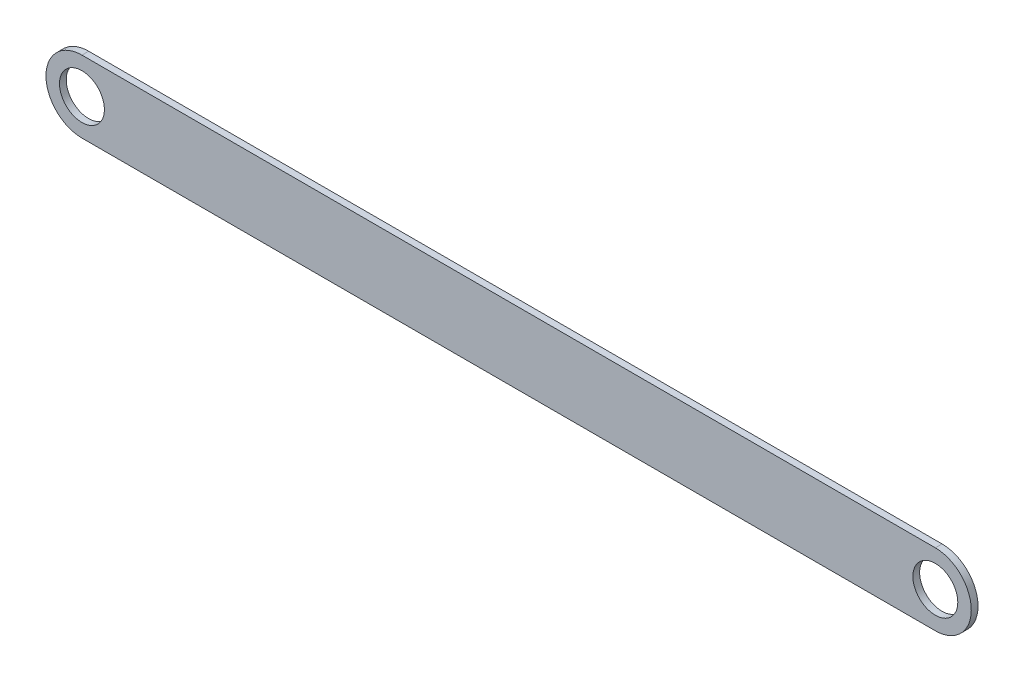
ISO-10303-21;
HEADER;
FILE_DESCRIPTION(('STEP AP214'),'2;1');
FILE_NAME('part.step','',(''),(''),'','','');
FILE_SCHEMA(('AUTOMOTIVE_DESIGN { 1 0 10303 214 1 1 1 1 }'));
ENDSEC;
DATA;
#1=APPLICATION_CONTEXT('core data for automotive mechanical design processes');
#2=APPLICATION_PROTOCOL_DEFINITION('international standard','automotive_design',2000,#1);
#3=PRODUCT_CONTEXT('',#1,'mechanical');
#4=PRODUCT('Part','Part','',(#3));
#5=PRODUCT_RELATED_PRODUCT_CATEGORY('part','',(#4));
#6=PRODUCT_DEFINITION_FORMATION('','',#4);
#7=PRODUCT_DEFINITION_CONTEXT('part definition',#1,'design');
#8=PRODUCT_DEFINITION('design','',#6,#7);
#9=PRODUCT_DEFINITION_SHAPE('','',#8);
#10=(LENGTH_UNIT() NAMED_UNIT(*) SI_UNIT(.MILLI.,.METRE.));
#11=(NAMED_UNIT(*) PLANE_ANGLE_UNIT() SI_UNIT($,.RADIAN.));
#12=(NAMED_UNIT(*) SI_UNIT($,.STERADIAN.) SOLID_ANGLE_UNIT());
#13=UNCERTAINTY_MEASURE_WITH_UNIT(LENGTH_MEASURE(1.E-05),#10,'distance_accuracy_value','');
#14=(GEOMETRIC_REPRESENTATION_CONTEXT(3) GLOBAL_UNCERTAINTY_ASSIGNED_CONTEXT((#13)) GLOBAL_UNIT_ASSIGNED_CONTEXT((#10,
#11,#12)) REPRESENTATION_CONTEXT('',''));
#15=CARTESIAN_POINT('',(0.,0.,0.));
#16=DIRECTION('',(0.,0.,1.));
#17=DIRECTION('',(1.,0.,0.));
#18=AXIS2_PLACEMENT_3D('',#15,#16,#17);
#19=CARTESIAN_POINT('',(-95.,0.,1.5));
#20=DIRECTION('',(0.,0.,1.));
#21=DIRECTION('',(1.,0.,0.));
#22=AXIS2_PLACEMENT_3D('',#19,#20,#21);
#23=PLANE('',#22);
#24=CARTESIAN_POINT('',(-95.,0.,1.5));
#25=DIRECTION('',(0.,0.,1.));
#26=DIRECTION('',(1.,0.,0.));
#27=AXIS2_PLACEMENT_3D('',#24,#25,#26);
#28=CIRCLE('',#27,5.);
#29=CARTESIAN_POINT('',(-90.,0.,1.5));
#30=VERTEX_POINT('',#29);
#31=EDGE_CURVE('E104',#30,#30,#28,.T.);
#32=ORIENTED_EDGE('',*,*,#31,.F.);
#33=EDGE_LOOP('',(#32));
#34=FACE_BOUND('',#33,.T.);
#35=CARTESIAN_POINT('',(-95.,0.,1.5));
#36=DIRECTION('',(0.,0.,1.));
#37=DIRECTION('',(1.,0.,0.));
#38=AXIS2_PLACEMENT_3D('',#35,#36,#37);
#39=CIRCLE('',#38,8.);
#40=CARTESIAN_POINT('',(-95.,8.,1.5));
#41=VERTEX_POINT('',#40);
#42=CARTESIAN_POINT('',(-95.,-8.,1.5));
#43=VERTEX_POINT('',#42);
#44=EDGE_CURVE('E89',#41,#43,#39,.T.);
#45=ORIENTED_EDGE('',*,*,#44,.T.);
#46=DIRECTION('',(1.,0.,0.));
#47=VECTOR('',#46,1.);
#48=CARTESIAN_POINT('',(-95.,-8.,1.5));
#49=LINE('',#48,#47);
#50=CARTESIAN_POINT('',(95.,-7.99999999999997,1.5));
#51=VERTEX_POINT('',#50);
#52=EDGE_CURVE('E84',#43,#51,#49,.T.);
#53=ORIENTED_EDGE('',*,*,#52,.T.);
#54=CARTESIAN_POINT('',(95.,0.,1.5));
#55=DIRECTION('',(0.,0.,1.));
#56=DIRECTION('',(1.,0.,0.));
#57=AXIS2_PLACEMENT_3D('',#54,#55,#56);
#58=CIRCLE('',#57,8.);
#59=CARTESIAN_POINT('',(95.,8.00000000000004,1.5));
#60=VERTEX_POINT('',#59);
#61=EDGE_CURVE('E87',#51,#60,#58,.T.);
#62=ORIENTED_EDGE('',*,*,#61,.T.);
#63=DIRECTION('',(-1.,0.,0.));
#64=VECTOR('',#63,1.);
#65=CARTESIAN_POINT('',(-95.,8.,1.5));
#66=LINE('',#65,#64);
#67=EDGE_CURVE('E54',#60,#41,#66,.T.);
#68=ORIENTED_EDGE('',*,*,#67,.T.);
#69=EDGE_LOOP('',(#45,#53,#62,#68));
#70=FACE_BOUND('',#69,.T.);
#71=CARTESIAN_POINT('',(95.,0.,1.5));
#72=DIRECTION('',(0.,0.,1.));
#73=DIRECTION('',(1.,0.,0.));
#74=AXIS2_PLACEMENT_3D('',#71,#72,#73);
#75=CIRCLE('',#74,5.);
#76=CARTESIAN_POINT('',(100.,0.,1.5));
#77=VERTEX_POINT('',#76);
#78=EDGE_CURVE('E119',#77,#77,#75,.T.);
#79=ORIENTED_EDGE('',*,*,#78,.F.);
#80=EDGE_LOOP('',(#79));
#81=FACE_BOUND('',#80,.T.);
#82=ADVANCED_FACE('F37',(#34,#70,#81),#23,.T.);
#83=CARTESIAN_POINT('',(-95.,0.,0.));
#84=DIRECTION('',(0.,0.,1.));
#85=DIRECTION('',(1.,0.,0.));
#86=AXIS2_PLACEMENT_3D('',#83,#84,#85);
#87=PLANE('',#86);
#88=CARTESIAN_POINT('',(-95.,0.,0.));
#89=DIRECTION('',(0.,0.,1.));
#90=DIRECTION('',(1.,0.,0.));
#91=AXIS2_PLACEMENT_3D('',#88,#89,#90);
#92=CIRCLE('',#91,8.);
#93=CARTESIAN_POINT('',(-95.,8.,0.));
#94=VERTEX_POINT('',#93);
#95=CARTESIAN_POINT('',(-95.,-8.,0.));
#96=VERTEX_POINT('',#95);
#97=EDGE_CURVE('E101',#94,#96,#92,.T.);
#98=ORIENTED_EDGE('',*,*,#97,.F.);
#99=DIRECTION('',(-1.,0.,0.));
#100=VECTOR('',#99,1.);
#101=CARTESIAN_POINT('',(-95.,8.,0.));
#102=LINE('',#101,#100);
#103=CARTESIAN_POINT('',(95.,8.00000000000004,0.));
#104=VERTEX_POINT('',#103);
#105=EDGE_CURVE('E77',#104,#94,#102,.T.);
#106=ORIENTED_EDGE('',*,*,#105,.F.);
#107=CARTESIAN_POINT('',(95.,0.,0.));
#108=DIRECTION('',(0.,0.,1.));
#109=DIRECTION('',(1.,0.,0.));
#110=AXIS2_PLACEMENT_3D('',#107,#108,#109);
#111=CIRCLE('',#110,8.);
#112=CARTESIAN_POINT('',(95.,-7.99999999999997,0.));
#113=VERTEX_POINT('',#112);
#114=EDGE_CURVE('E71',#113,#104,#111,.T.);
#115=ORIENTED_EDGE('',*,*,#114,.F.);
#116=DIRECTION('',(1.,0.,0.));
#117=VECTOR('',#116,1.);
#118=CARTESIAN_POINT('',(-95.,-8.,0.));
#119=LINE('',#118,#117);
#120=EDGE_CURVE('E93',#96,#113,#119,.T.);
#121=ORIENTED_EDGE('',*,*,#120,.F.);
#122=EDGE_LOOP('',(#98,#106,#115,#121));
#123=FACE_BOUND('',#122,.T.);
#124=CARTESIAN_POINT('',(-95.,0.,0.));
#125=DIRECTION('',(0.,0.,1.));
#126=DIRECTION('',(1.,0.,0.));
#127=AXIS2_PLACEMENT_3D('',#124,#125,#126);
#128=CIRCLE('',#127,5.);
#129=CARTESIAN_POINT('',(-90.,0.,0.));
#130=VERTEX_POINT('',#129);
#131=EDGE_CURVE('E116',#130,#130,#128,.T.);
#132=ORIENTED_EDGE('',*,*,#131,.T.);
#133=EDGE_LOOP('',(#132));
#134=FACE_BOUND('',#133,.T.);
#135=CARTESIAN_POINT('',(95.,0.,0.));
#136=DIRECTION('',(0.,0.,1.));
#137=DIRECTION('',(1.,0.,0.));
#138=AXIS2_PLACEMENT_3D('',#135,#136,#137);
#139=CIRCLE('',#138,5.);
#140=CARTESIAN_POINT('',(100.,0.,0.));
#141=VERTEX_POINT('',#140);
#142=EDGE_CURVE('E122',#141,#141,#139,.T.);
#143=ORIENTED_EDGE('',*,*,#142,.T.);
#144=EDGE_LOOP('',(#143));
#145=FACE_BOUND('',#144,.T.);
#146=ADVANCED_FACE('F112',(#123,#134,#145),#87,.F.);
#147=CARTESIAN_POINT('',(-95.,0.,1.5));
#148=DIRECTION('',(0.,0.,-1.));
#149=DIRECTION('',(-1.,0.,0.));
#150=AXIS2_PLACEMENT_3D('',#147,#148,#149);
#151=CYLINDRICAL_SURFACE('',#150,8.);
#152=ORIENTED_EDGE('',*,*,#97,.T.);
#153=DIRECTION('',(0.,0.,-1.));
#154=VECTOR('',#153,1.);
#155=CARTESIAN_POINT('',(-95.,-8.,1.5));
#156=LINE('',#155,#154);
#157=EDGE_CURVE('E11',#43,#96,#156,.T.);
#158=ORIENTED_EDGE('',*,*,#157,.F.);
#159=ORIENTED_EDGE('',*,*,#44,.F.);
#160=DIRECTION('',(0.,0.,-1.));
#161=VECTOR('',#160,1.);
#162=CARTESIAN_POINT('',(-95.,8.,1.5));
#163=LINE('',#162,#161);
#164=EDGE_CURVE('E97',#41,#94,#163,.T.);
#165=ORIENTED_EDGE('',*,*,#164,.T.);
#166=EDGE_LOOP('',(#152,#158,#159,#165));
#167=FACE_BOUND('',#166,.T.);
#168=ADVANCED_FACE('F39',(#167),#151,.T.);
#169=CARTESIAN_POINT('',(-95.,-8.,1.5));
#170=DIRECTION('',(0.,1.,0.));
#171=DIRECTION('',(-1.,0.,0.));
#172=AXIS2_PLACEMENT_3D('',#169,#170,#171);
#173=PLANE('',#172);
#174=ORIENTED_EDGE('',*,*,#120,.T.);
#175=DIRECTION('',(0.,0.,-1.));
#176=VECTOR('',#175,1.);
#177=CARTESIAN_POINT('',(95.,-7.99999999999997,1.5));
#178=LINE('',#177,#176);
#179=EDGE_CURVE('E46',#51,#113,#178,.T.);
#180=ORIENTED_EDGE('',*,*,#179,.F.);
#181=ORIENTED_EDGE('',*,*,#52,.F.);
#182=ORIENTED_EDGE('',*,*,#157,.T.);
#183=EDGE_LOOP('',(#174,#180,#181,#182));
#184=FACE_BOUND('',#183,.T.);
#185=ADVANCED_FACE('F92',(#184),#173,.F.);
#186=CARTESIAN_POINT('',(95.,0.,1.5));
#187=DIRECTION('',(0.,0.,-1.));
#188=DIRECTION('',(-1.,0.,0.));
#189=AXIS2_PLACEMENT_3D('',#186,#187,#188);
#190=CYLINDRICAL_SURFACE('',#189,8.);
#191=ORIENTED_EDGE('',*,*,#114,.T.);
#192=DIRECTION('',(0.,0.,-1.));
#193=VECTOR('',#192,1.);
#194=CARTESIAN_POINT('',(95.,8.00000000000004,1.5));
#195=LINE('',#194,#193);
#196=EDGE_CURVE('E94',#60,#104,#195,.T.);
#197=ORIENTED_EDGE('',*,*,#196,.F.);
#198=ORIENTED_EDGE('',*,*,#61,.F.);
#199=ORIENTED_EDGE('',*,*,#179,.T.);
#200=EDGE_LOOP('',(#191,#197,#198,#199));
#201=FACE_BOUND('',#200,.T.);
#202=ADVANCED_FACE('F95',(#201),#190,.T.);
#203=CARTESIAN_POINT('',(-95.,8.,1.5));
#204=DIRECTION('',(0.,-1.,0.));
#205=DIRECTION('',(1.,0.,0.));
#206=AXIS2_PLACEMENT_3D('',#203,#204,#205);
#207=PLANE('',#206);
#208=ORIENTED_EDGE('',*,*,#105,.T.);
#209=ORIENTED_EDGE('',*,*,#164,.F.);
#210=ORIENTED_EDGE('',*,*,#67,.F.);
#211=ORIENTED_EDGE('',*,*,#196,.T.);
#212=EDGE_LOOP('',(#208,#209,#210,#211));
#213=FACE_BOUND('',#212,.T.);
#214=ADVANCED_FACE('F109',(#213),#207,.F.);
#215=CARTESIAN_POINT('',(-95.,0.,1.5));
#216=DIRECTION('',(0.,0.,-1.));
#217=DIRECTION('',(-1.,0.,0.));
#218=AXIS2_PLACEMENT_3D('',#215,#216,#217);
#219=CYLINDRICAL_SURFACE('',#218,5.);
#220=ORIENTED_EDGE('',*,*,#31,.T.);
#221=EDGE_LOOP('',(#220));
#222=FACE_BOUND('',#221,.T.);
#223=ORIENTED_EDGE('',*,*,#131,.F.);
#224=EDGE_LOOP('',(#223));
#225=FACE_BOUND('',#224,.T.);
#226=ADVANCED_FACE('F139',(#222,#225),#219,.F.);
#227=CARTESIAN_POINT('',(95.,0.,1.5));
#228=DIRECTION('',(0.,0.,-1.));
#229=DIRECTION('',(-1.,0.,0.));
#230=AXIS2_PLACEMENT_3D('',#227,#228,#229);
#231=CYLINDRICAL_SURFACE('',#230,5.);
#232=ORIENTED_EDGE('',*,*,#78,.T.);
#233=EDGE_LOOP('',(#232));
#234=FACE_BOUND('',#233,.T.);
#235=ORIENTED_EDGE('',*,*,#142,.F.);
#236=EDGE_LOOP('',(#235));
#237=FACE_BOUND('',#236,.T.);
#238=ADVANCED_FACE('F128',(#234,#237),#231,.F.);
#239=CLOSED_SHELL('',(#82,#146,#168,#185,#202,#214,#226,#238));
#240=MANIFOLD_SOLID_BREP('B2',#239);
#241=ADVANCED_BREP_SHAPE_REPRESENTATION('',(#18,#240),#14);
#242=SHAPE_DEFINITION_REPRESENTATION(#9,#241);
ENDSEC;
END-ISO-10303-21;
